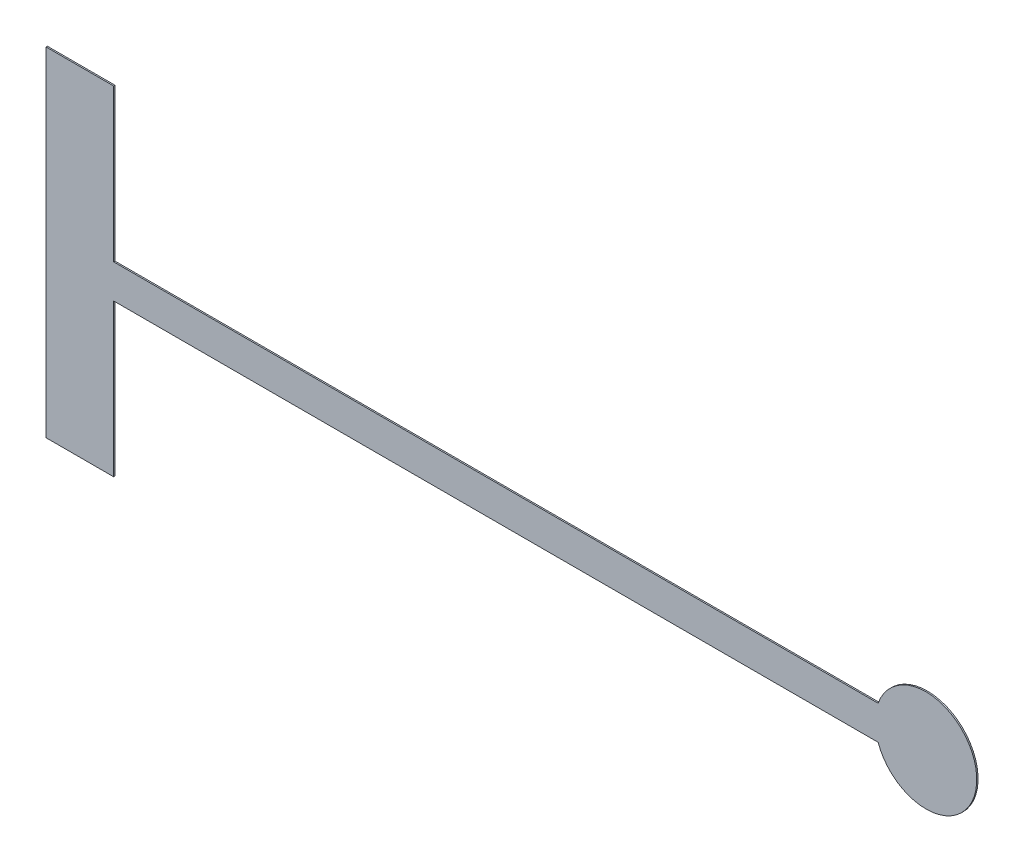
ISO-10303-21;
HEADER;
FILE_DESCRIPTION(('STEP AP214'),'2;1');
FILE_NAME('part.step','',(''),(''),'','','');
FILE_SCHEMA(('AUTOMOTIVE_DESIGN { 1 0 10303 214 1 1 1 1 }'));
ENDSEC;
DATA;
#1=APPLICATION_CONTEXT('core data for automotive mechanical design processes');
#2=APPLICATION_PROTOCOL_DEFINITION('international standard','automotive_design',2000,#1);
#3=PRODUCT_CONTEXT('',#1,'mechanical');
#4=PRODUCT('Part','Part','',(#3));
#5=PRODUCT_RELATED_PRODUCT_CATEGORY('part','',(#4));
#6=PRODUCT_DEFINITION_FORMATION('','',#4);
#7=PRODUCT_DEFINITION_CONTEXT('part definition',#1,'design');
#8=PRODUCT_DEFINITION('design','',#6,#7);
#9=PRODUCT_DEFINITION_SHAPE('','',#8);
#10=(LENGTH_UNIT() NAMED_UNIT(*) SI_UNIT(.MILLI.,.METRE.));
#11=(NAMED_UNIT(*) PLANE_ANGLE_UNIT() SI_UNIT($,.RADIAN.));
#12=(NAMED_UNIT(*) SI_UNIT($,.STERADIAN.) SOLID_ANGLE_UNIT());
#13=UNCERTAINTY_MEASURE_WITH_UNIT(LENGTH_MEASURE(1.E-05),#10,'distance_accuracy_value','');
#14=(GEOMETRIC_REPRESENTATION_CONTEXT(3) GLOBAL_UNCERTAINTY_ASSIGNED_CONTEXT((#13)) GLOBAL_UNIT_ASSIGNED_CONTEXT((#10,
#11,#12)) REPRESENTATION_CONTEXT('',''));
#15=CARTESIAN_POINT('',(0.,0.,0.));
#16=DIRECTION('',(0.,0.,1.));
#17=DIRECTION('',(1.,0.,0.));
#18=AXIS2_PLACEMENT_3D('',#15,#16,#17);
#19=CARTESIAN_POINT('',(1000.,-250.,-20.));
#20=DIRECTION('',(0.,-1.,0.));
#21=DIRECTION('',(1.,0.,0.));
#22=AXIS2_PLACEMENT_3D('',#19,#20,#21);
#23=PLANE('',#22);
#24=DIRECTION('',(1.,0.,0.));
#25=VECTOR('',#24,1.);
#26=CARTESIAN_POINT('',(1000.,-250.,-20.));
#27=LINE('',#26,#25);
#28=CARTESIAN_POINT('',(0.,-250.,-20.));
#29=VERTEX_POINT('',#28);
#30=CARTESIAN_POINT('',(11292.8932188135,-250.,-20.));
#31=VERTEX_POINT('',#30);
#32=EDGE_CURVE('E124',#29,#31,#27,.T.);
#33=ORIENTED_EDGE('',*,*,#32,.T.);
#34=DIRECTION('',(0.,0.,1.));
#35=VECTOR('',#34,1.);
#36=CARTESIAN_POINT('',(11292.8932188135,-250.,-20.));
#37=LINE('',#36,#35);
#38=CARTESIAN_POINT('',(11292.8932188135,-250.,0.));
#39=VERTEX_POINT('',#38);
#40=EDGE_CURVE('E123',#31,#39,#37,.T.);
#41=ORIENTED_EDGE('',*,*,#40,.T.);
#42=DIRECTION('',(1.,0.,0.));
#43=VECTOR('',#42,1.);
#44=CARTESIAN_POINT('',(1000.,-250.,0.));
#45=LINE('',#44,#43);
#46=CARTESIAN_POINT('',(0.,-250.,0.));
#47=VERTEX_POINT('',#46);
#48=EDGE_CURVE('E109',#47,#39,#45,.T.);
#49=ORIENTED_EDGE('',*,*,#48,.F.);
#50=DIRECTION('',(0.,0.,1.));
#51=VECTOR('',#50,1.);
#52=CARTESIAN_POINT('',(0.,-250.,-20.));
#53=LINE('',#52,#51);
#54=EDGE_CURVE('E188',#29,#47,#53,.T.);
#55=ORIENTED_EDGE('',*,*,#54,.F.);
#56=EDGE_LOOP('',(#33,#41,#49,#55));
#57=FACE_BOUND('',#56,.T.);
#58=ADVANCED_FACE('F43',(#57),#23,.T.);
#59=CARTESIAN_POINT('',(12000.,2.44249065417534E-12,-20.));
#60=DIRECTION('',(0.,0.,1.));
#61=DIRECTION('',(1.,0.,0.));
#62=AXIS2_PLACEMENT_3D('',#59,#60,#61);
#63=PLANE('',#62);
#64=DIRECTION('',(-1.,0.,0.));
#65=VECTOR('',#64,1.);
#66=CARTESIAN_POINT('',(1000.,250.,-20.));
#67=LINE('',#66,#65);
#68=CARTESIAN_POINT('',(11292.8932188135,250.000000000001,-20.));
#69=VERTEX_POINT('',#68);
#70=CARTESIAN_POINT('',(-2.22044604925031E-13,250.,-20.));
#71=VERTEX_POINT('',#70);
#72=EDGE_CURVE('E58',#69,#71,#67,.T.);
#73=ORIENTED_EDGE('',*,*,#72,.F.);
#74=CARTESIAN_POINT('',(12000.,2.44249065417534E-12,-20.));
#75=DIRECTION('',(0.,0.,1.));
#76=DIRECTION('',(1.,0.,0.));
#77=AXIS2_PLACEMENT_3D('',#74,#75,#76);
#78=CIRCLE('',#77,749.999999999999);
#79=EDGE_CURVE('E148',#31,#69,#78,.T.);
#80=ORIENTED_EDGE('',*,*,#79,.F.);
#81=ORIENTED_EDGE('',*,*,#32,.F.);
#82=DIRECTION('',(0.,-1.,0.));
#83=VECTOR('',#82,1.);
#84=CARTESIAN_POINT('',(0.,-2500.,-20.));
#85=LINE('',#84,#83);
#86=CARTESIAN_POINT('',(0.,-2500.,-20.));
#87=VERTEX_POINT('',#86);
#88=EDGE_CURVE('E153',#29,#87,#85,.T.);
#89=ORIENTED_EDGE('',*,*,#88,.T.);
#90=DIRECTION('',(1.,0.,0.));
#91=VECTOR('',#90,1.);
#92=CARTESIAN_POINT('',(-1000.,-2500.,-20.));
#93=LINE('',#92,#91);
#94=CARTESIAN_POINT('',(-1000.,-2500.,-20.));
#95=VERTEX_POINT('',#94);
#96=EDGE_CURVE('E164',#95,#87,#93,.T.);
#97=ORIENTED_EDGE('',*,*,#96,.F.);
#98=DIRECTION('',(0.,-1.,0.));
#99=VECTOR('',#98,1.);
#100=CARTESIAN_POINT('',(-1000.,2500.,-20.));
#101=LINE('',#100,#99);
#102=CARTESIAN_POINT('',(-1000.,2500.,-20.));
#103=VERTEX_POINT('',#102);
#104=EDGE_CURVE('E161',#103,#95,#101,.T.);
#105=ORIENTED_EDGE('',*,*,#104,.F.);
#106=DIRECTION('',(-1.,0.,0.));
#107=VECTOR('',#106,1.);
#108=CARTESIAN_POINT('',(-1000.,2500.,-20.));
#109=LINE('',#108,#107);
#110=CARTESIAN_POINT('',(-4.44089209850063E-13,2500.,-20.));
#111=VERTEX_POINT('',#110);
#112=EDGE_CURVE('E158',#111,#103,#109,.T.);
#113=ORIENTED_EDGE('',*,*,#112,.F.);
#114=DIRECTION('',(0.,-1.,0.));
#115=VECTOR('',#114,1.);
#116=CARTESIAN_POINT('',(-4.44089209850063E-13,2500.,-20.));
#117=LINE('',#116,#115);
#118=EDGE_CURVE('E198',#111,#71,#117,.T.);
#119=ORIENTED_EDGE('',*,*,#118,.T.);
#120=EDGE_LOOP('',(#73,#80,#81,#89,#97,#105,#113,#119));
#121=FACE_BOUND('',#120,.T.);
#122=ADVANCED_FACE('F200',(#121),#63,.F.);
#123=CARTESIAN_POINT('',(12000.,2.44249065417534E-12,0.));
#124=DIRECTION('',(0.,0.,1.));
#125=DIRECTION('',(1.,0.,0.));
#126=AXIS2_PLACEMENT_3D('',#123,#124,#125);
#127=PLANE('',#126);
#128=CARTESIAN_POINT('',(12000.,2.44249065417534E-12,0.));
#129=DIRECTION('',(0.,0.,1.));
#130=DIRECTION('',(1.,0.,0.));
#131=AXIS2_PLACEMENT_3D('',#128,#129,#130);
#132=CIRCLE('',#131,749.999999999999);
#133=CARTESIAN_POINT('',(11292.8932188135,250.000000000001,0.));
#134=VERTEX_POINT('',#133);
#135=EDGE_CURVE('E113',#39,#134,#132,.T.);
#136=ORIENTED_EDGE('',*,*,#135,.T.);
#137=DIRECTION('',(-1.,0.,0.));
#138=VECTOR('',#137,1.);
#139=CARTESIAN_POINT('',(1000.,250.,0.));
#140=LINE('',#139,#138);
#141=CARTESIAN_POINT('',(-2.22044604925031E-13,250.,0.));
#142=VERTEX_POINT('',#141);
#143=EDGE_CURVE('E66',#134,#142,#140,.T.);
#144=ORIENTED_EDGE('',*,*,#143,.T.);
#145=DIRECTION('',(0.,-1.,0.));
#146=VECTOR('',#145,1.);
#147=CARTESIAN_POINT('',(-4.44089209850063E-13,2500.,0.));
#148=LINE('',#147,#146);
#149=CARTESIAN_POINT('',(0.,2500.,0.));
#150=VERTEX_POINT('',#149);
#151=EDGE_CURVE('E194',#150,#142,#148,.T.);
#152=ORIENTED_EDGE('',*,*,#151,.F.);
#153=DIRECTION('',(-1.,0.,0.));
#154=VECTOR('',#153,1.);
#155=CARTESIAN_POINT('',(-1000.,2500.,0.));
#156=LINE('',#155,#154);
#157=CARTESIAN_POINT('',(-1000.,2500.,0.));
#158=VERTEX_POINT('',#157);
#159=EDGE_CURVE('E134',#150,#158,#156,.T.);
#160=ORIENTED_EDGE('',*,*,#159,.T.);
#161=DIRECTION('',(0.,-1.,0.));
#162=VECTOR('',#161,1.);
#163=CARTESIAN_POINT('',(-1000.,2500.,0.));
#164=LINE('',#163,#162);
#165=CARTESIAN_POINT('',(-1000.,-2500.,0.));
#166=VERTEX_POINT('',#165);
#167=EDGE_CURVE('E140',#158,#166,#164,.T.);
#168=ORIENTED_EDGE('',*,*,#167,.T.);
#169=DIRECTION('',(1.,0.,0.));
#170=VECTOR('',#169,1.);
#171=CARTESIAN_POINT('',(-1000.,-2500.,0.));
#172=LINE('',#171,#170);
#173=CARTESIAN_POINT('',(0.,-2500.,0.));
#174=VERTEX_POINT('',#173);
#175=EDGE_CURVE('E144',#166,#174,#172,.T.);
#176=ORIENTED_EDGE('',*,*,#175,.T.);
#177=DIRECTION('',(0.,-1.,0.));
#178=VECTOR('',#177,1.);
#179=CARTESIAN_POINT('',(0.,-2500.,0.));
#180=LINE('',#179,#178);
#181=EDGE_CURVE('E115',#47,#174,#180,.T.);
#182=ORIENTED_EDGE('',*,*,#181,.F.);
#183=ORIENTED_EDGE('',*,*,#48,.T.);
#184=EDGE_LOOP('',(#136,#144,#152,#160,#168,#176,#182,#183));
#185=FACE_BOUND('',#184,.T.);
#186=ADVANCED_FACE('F111',(#185),#127,.T.);
#187=CARTESIAN_POINT('',(-1000.,-2500.,-20.));
#188=DIRECTION('',(0.,-1.,0.));
#189=DIRECTION('',(0.,0.,-1.));
#190=AXIS2_PLACEMENT_3D('',#187,#188,#189);
#191=PLANE('',#190);
#192=DIRECTION('',(0.,0.,1.));
#193=VECTOR('',#192,1.);
#194=CARTESIAN_POINT('',(0.,-2500.,-20.));
#195=LINE('',#194,#193);
#196=EDGE_CURVE('E127',#87,#174,#195,.T.);
#197=ORIENTED_EDGE('',*,*,#196,.T.);
#198=ORIENTED_EDGE('',*,*,#175,.F.);
#199=DIRECTION('',(0.,0.,1.));
#200=VECTOR('',#199,1.);
#201=CARTESIAN_POINT('',(-1000.,-2500.,-20.));
#202=LINE('',#201,#200);
#203=EDGE_CURVE('E11',#95,#166,#202,.T.);
#204=ORIENTED_EDGE('',*,*,#203,.F.);
#205=ORIENTED_EDGE('',*,*,#96,.T.);
#206=EDGE_LOOP('',(#197,#198,#204,#205));
#207=FACE_BOUND('',#206,.T.);
#208=ADVANCED_FACE('F183',(#207),#191,.T.);
#209=CARTESIAN_POINT('',(-1000.,2500.,-20.));
#210=DIRECTION('',(-1.,0.,0.));
#211=DIRECTION('',(0.,-1.,0.));
#212=AXIS2_PLACEMENT_3D('',#209,#210,#211);
#213=PLANE('',#212);
#214=ORIENTED_EDGE('',*,*,#167,.F.);
#215=DIRECTION('',(0.,0.,1.));
#216=VECTOR('',#215,1.);
#217=CARTESIAN_POINT('',(-1000.,2500.,-20.));
#218=LINE('',#217,#216);
#219=EDGE_CURVE('E46',#103,#158,#218,.T.);
#220=ORIENTED_EDGE('',*,*,#219,.F.);
#221=ORIENTED_EDGE('',*,*,#104,.T.);
#222=ORIENTED_EDGE('',*,*,#203,.T.);
#223=EDGE_LOOP('',(#214,#220,#221,#222));
#224=FACE_BOUND('',#223,.T.);
#225=ADVANCED_FACE('F181',(#224),#213,.T.);
#226=CARTESIAN_POINT('',(-1000.,2500.,-20.));
#227=DIRECTION('',(0.,1.,0.));
#228=DIRECTION('',(0.,0.,1.));
#229=AXIS2_PLACEMENT_3D('',#226,#227,#228);
#230=PLANE('',#229);
#231=DIRECTION('',(0.,0.,1.));
#232=VECTOR('',#231,1.);
#233=CARTESIAN_POINT('',(-4.44089209850063E-13,2500.,-20.));
#234=LINE('',#233,#232);
#235=EDGE_CURVE('E322',#111,#150,#234,.T.);
#236=ORIENTED_EDGE('',*,*,#235,.F.);
#237=ORIENTED_EDGE('',*,*,#112,.T.);
#238=ORIENTED_EDGE('',*,*,#219,.T.);
#239=ORIENTED_EDGE('',*,*,#159,.F.);
#240=EDGE_LOOP('',(#236,#237,#238,#239));
#241=FACE_BOUND('',#240,.T.);
#242=ADVANCED_FACE('F177',(#241),#230,.T.);
#243=CARTESIAN_POINT('',(1000.,250.,-20.));
#244=DIRECTION('',(0.,1.,0.));
#245=DIRECTION('',(0.,0.,1.));
#246=AXIS2_PLACEMENT_3D('',#243,#244,#245);
#247=PLANE('',#246);
#248=ORIENTED_EDGE('',*,*,#143,.F.);
#249=DIRECTION('',(0.,0.,1.));
#250=VECTOR('',#249,1.);
#251=CARTESIAN_POINT('',(11292.8932188135,250.,-20.));
#252=LINE('',#251,#250);
#253=EDGE_CURVE('E128',#134,#69,#252,.F.);
#254=ORIENTED_EDGE('',*,*,#253,.T.);
#255=ORIENTED_EDGE('',*,*,#72,.T.);
#256=DIRECTION('',(0.,0.,1.));
#257=VECTOR('',#256,1.);
#258=CARTESIAN_POINT('',(-2.22044604925031E-13,250.,-20.));
#259=LINE('',#258,#257);
#260=EDGE_CURVE('E120',#71,#142,#259,.T.);
#261=ORIENTED_EDGE('',*,*,#260,.T.);
#262=EDGE_LOOP('',(#248,#254,#255,#261));
#263=FACE_BOUND('',#262,.T.);
#264=ADVANCED_FACE('F211',(#263),#247,.T.);
#265=CARTESIAN_POINT('',(12000.,2.44249065417534E-12,-20.));
#266=DIRECTION('',(0.,0.,1.));
#267=DIRECTION('',(1.,0.,0.));
#268=AXIS2_PLACEMENT_3D('',#265,#266,#267);
#269=CYLINDRICAL_SURFACE('',#268,749.999999999999);
#270=ORIENTED_EDGE('',*,*,#253,.F.);
#271=ORIENTED_EDGE('',*,*,#135,.F.);
#272=ORIENTED_EDGE('',*,*,#40,.F.);
#273=ORIENTED_EDGE('',*,*,#79,.T.);
#274=EDGE_LOOP('',(#270,#271,#272,#273));
#275=FACE_BOUND('',#274,.T.);
#276=ADVANCED_FACE('F130',(#275),#269,.T.);
#277=CARTESIAN_POINT('',(0.,-2500.,-20.));
#278=DIRECTION('',(-1.,0.,0.));
#279=DIRECTION('',(0.,0.,1.));
#280=AXIS2_PLACEMENT_3D('',#277,#278,#279);
#281=PLANE('',#280);
#282=ORIENTED_EDGE('',*,*,#181,.T.);
#283=ORIENTED_EDGE('',*,*,#196,.F.);
#284=ORIENTED_EDGE('',*,*,#88,.F.);
#285=ORIENTED_EDGE('',*,*,#54,.T.);
#286=EDGE_LOOP('',(#282,#283,#284,#285));
#287=FACE_BOUND('',#286,.T.);
#288=ADVANCED_FACE('F201',(#287),#281,.F.);
#289=CARTESIAN_POINT('',(-4.44089209850063E-13,2500.,-20.));
#290=DIRECTION('',(-1.,0.,0.));
#291=DIRECTION('',(0.,-1.,0.));
#292=AXIS2_PLACEMENT_3D('',#289,#290,#291);
#293=PLANE('',#292);
#294=ORIENTED_EDGE('',*,*,#151,.T.);
#295=ORIENTED_EDGE('',*,*,#260,.F.);
#296=ORIENTED_EDGE('',*,*,#118,.F.);
#297=ORIENTED_EDGE('',*,*,#235,.T.);
#298=EDGE_LOOP('',(#294,#295,#296,#297));
#299=FACE_BOUND('',#298,.T.);
#300=ADVANCED_FACE('F203',(#299),#293,.F.);
#301=CLOSED_SHELL('',(#58,#122,#186,#208,#225,#242,#264,#276,#288,#300));
#302=MANIFOLD_SOLID_BREP('B2',#301);
#303=ADVANCED_BREP_SHAPE_REPRESENTATION('',(#18,#302),#14);
#304=SHAPE_DEFINITION_REPRESENTATION(#9,#303);
ENDSEC;
END-ISO-10303-21;
